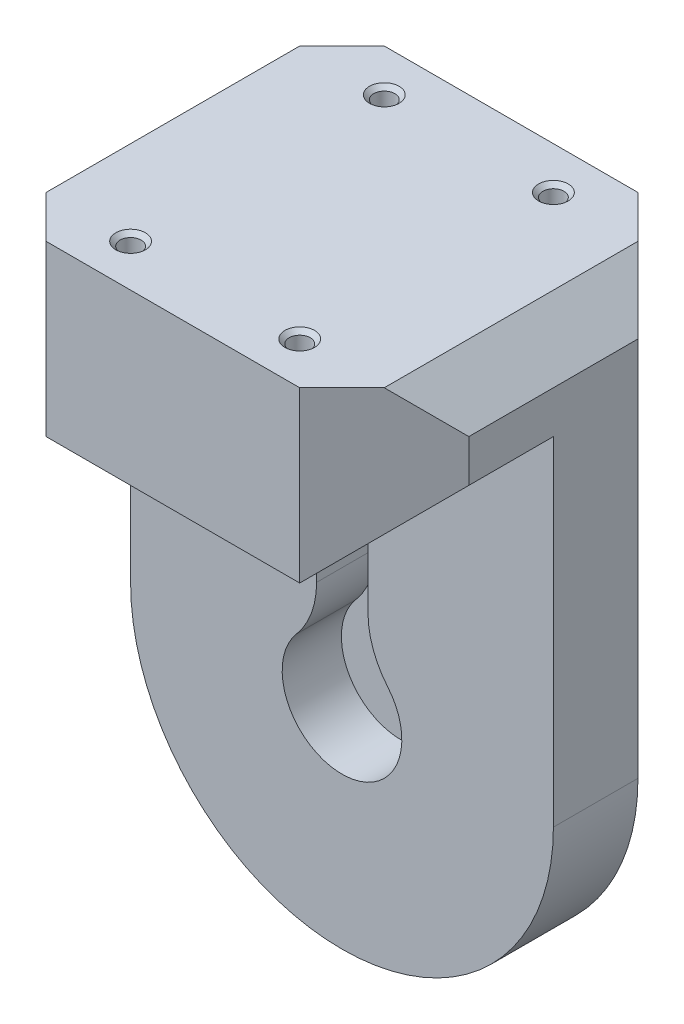
ISO-10303-21;
HEADER;
FILE_DESCRIPTION(('STEP AP214'),'2;1');
FILE_NAME('part.step','',(''),(''),'','','');
FILE_SCHEMA(('AUTOMOTIVE_DESIGN { 1 0 10303 214 1 1 1 1 }'));
ENDSEC;
DATA;
#1=APPLICATION_CONTEXT('core data for automotive mechanical design processes');
#2=APPLICATION_PROTOCOL_DEFINITION('international standard','automotive_design',2000,#1);
#3=PRODUCT_CONTEXT('',#1,'mechanical');
#4=PRODUCT('Part','Part','',(#3));
#5=PRODUCT_RELATED_PRODUCT_CATEGORY('part','',(#4));
#6=PRODUCT_DEFINITION_FORMATION('','',#4);
#7=PRODUCT_DEFINITION_CONTEXT('part definition',#1,'design');
#8=PRODUCT_DEFINITION('design','',#6,#7);
#9=PRODUCT_DEFINITION_SHAPE('','',#8);
#10=(LENGTH_UNIT() NAMED_UNIT(*) SI_UNIT(.MILLI.,.METRE.));
#11=(NAMED_UNIT(*) PLANE_ANGLE_UNIT() SI_UNIT($,.RADIAN.));
#12=(NAMED_UNIT(*) SI_UNIT($,.STERADIAN.) SOLID_ANGLE_UNIT());
#13=UNCERTAINTY_MEASURE_WITH_UNIT(LENGTH_MEASURE(1.E-05),#10,'distance_accuracy_value','');
#14=(GEOMETRIC_REPRESENTATION_CONTEXT(3) GLOBAL_UNCERTAINTY_ASSIGNED_CONTEXT((#13)) GLOBAL_UNIT_ASSIGNED_CONTEXT((#10,
#11,#12)) REPRESENTATION_CONTEXT('',''));
#15=CARTESIAN_POINT('',(0.,0.,0.));
#16=DIRECTION('',(0.,0.,1.));
#17=DIRECTION('',(1.,0.,0.));
#18=AXIS2_PLACEMENT_3D('',#15,#16,#17);
#19=CARTESIAN_POINT('',(-25.,50.,10.));
#20=DIRECTION('',(0.,-1.,0.));
#21=DIRECTION('',(0.,0.,-1.));
#22=AXIS2_PLACEMENT_3D('',#19,#20,#21);
#23=PLANE('',#22);
#24=CARTESIAN_POINT('',(-10.0000000000001,50.,25.));
#25=DIRECTION('',(0.,-1.,0.));
#26=DIRECTION('',(0.,0.,-1.));
#27=AXIS2_PLACEMENT_3D('',#24,#25,#26);
#28=CIRCLE('',#27,1.75);
#29=CARTESIAN_POINT('',(-10.0000000000001,50.,23.25));
#30=VERTEX_POINT('',#29);
#31=EDGE_CURVE('E346',#30,#30,#28,.T.);
#32=ORIENTED_EDGE('',*,*,#31,.T.);
#33=EDGE_LOOP('',(#32));
#34=FACE_BOUND('',#33,.T.);
#35=CARTESIAN_POINT('',(-10.,50.,-5.00000000000002));
#36=DIRECTION('',(0.,-1.,0.));
#37=DIRECTION('',(0.,0.,-1.));
#38=AXIS2_PLACEMENT_3D('',#35,#36,#37);
#39=CIRCLE('',#38,1.75);
#40=CARTESIAN_POINT('',(-10.,50.,-6.75000000000002));
#41=VERTEX_POINT('',#40);
#42=EDGE_CURVE('E343',#41,#41,#39,.T.);
#43=ORIENTED_EDGE('',*,*,#42,.T.);
#44=EDGE_LOOP('',(#43));
#45=FACE_BOUND('',#44,.T.);
#46=CARTESIAN_POINT('',(10.,50.,25.));
#47=DIRECTION('',(0.,-1.,0.));
#48=DIRECTION('',(0.,0.,-1.));
#49=AXIS2_PLACEMENT_3D('',#46,#47,#48);
#50=CIRCLE('',#49,1.75);
#51=CARTESIAN_POINT('',(10.,50.,23.25));
#52=VERTEX_POINT('',#51);
#53=EDGE_CURVE('E340',#52,#52,#50,.T.);
#54=ORIENTED_EDGE('',*,*,#53,.T.);
#55=EDGE_LOOP('',(#54));
#56=FACE_BOUND('',#55,.T.);
#57=CARTESIAN_POINT('',(10.,50.,-5.00000000000002));
#58=DIRECTION('',(0.,-1.,0.));
#59=DIRECTION('',(0.,0.,-1.));
#60=AXIS2_PLACEMENT_3D('',#57,#58,#59);
#61=CIRCLE('',#60,1.75);
#62=CARTESIAN_POINT('',(10.,50.,-6.75000000000002));
#63=VERTEX_POINT('',#62);
#64=EDGE_CURVE('E337',#63,#63,#61,.T.);
#65=ORIENTED_EDGE('',*,*,#64,.T.);
#66=EDGE_LOOP('',(#65));
#67=FACE_BOUND('',#66,.T.);
#68=DIRECTION('',(0.707106781186549,0.,-0.707106781186546));
#69=VECTOR('',#68,1.);
#70=CARTESIAN_POINT('',(-25.,50.,0.));
#71=LINE('',#70,#69);
#72=CARTESIAN_POINT('',(-15.,50.,-10.));
#73=VERTEX_POINT('',#72);
#74=CARTESIAN_POINT('',(-20.,50.,-5.));
#75=VERTEX_POINT('',#74);
#76=EDGE_CURVE('E263',#73,#75,#71,.F.);
#77=ORIENTED_EDGE('',*,*,#76,.T.);
#78=DIRECTION('',(0.,0.,1.));
#79=VECTOR('',#78,1.);
#80=CARTESIAN_POINT('',(-20.,50.,10.));
#81=LINE('',#80,#79);
#82=CARTESIAN_POINT('',(-20.,50.,25.));
#83=VERTEX_POINT('',#82);
#84=EDGE_CURVE('E326',#75,#83,#81,.T.);
#85=ORIENTED_EDGE('',*,*,#84,.T.);
#86=DIRECTION('',(-0.707106781186547,0.,-0.707106781186549));
#87=VECTOR('',#86,1.);
#88=CARTESIAN_POINT('',(-15.,50.,30.));
#89=LINE('',#88,#87);
#90=CARTESIAN_POINT('',(-15.,50.,30.));
#91=VERTEX_POINT('',#90);
#92=EDGE_CURVE('E298',#83,#91,#89,.F.);
#93=ORIENTED_EDGE('',*,*,#92,.T.);
#94=DIRECTION('',(-1.,0.,0.));
#95=VECTOR('',#94,1.);
#96=CARTESIAN_POINT('',(25.,50.,30.));
#97=LINE('',#96,#95);
#98=CARTESIAN_POINT('',(15.,50.,30.));
#99=VERTEX_POINT('',#98);
#100=EDGE_CURVE('E494',#99,#91,#97,.T.);
#101=ORIENTED_EDGE('',*,*,#100,.F.);
#102=DIRECTION('',(-0.707106781186547,0.,0.707106781186549));
#103=VECTOR('',#102,1.);
#104=CARTESIAN_POINT('',(15.,50.,30.));
#105=LINE('',#104,#103);
#106=CARTESIAN_POINT('',(20.,50.,25.));
#107=VERTEX_POINT('',#106);
#108=EDGE_CURVE('E295',#99,#107,#105,.F.);
#109=ORIENTED_EDGE('',*,*,#108,.T.);
#110=DIRECTION('',(0.,0.,-1.));
#111=VECTOR('',#110,1.);
#112=CARTESIAN_POINT('',(20.,50.,10.));
#113=LINE('',#112,#111);
#114=CARTESIAN_POINT('',(20.,50.,-5.));
#115=VERTEX_POINT('',#114);
#116=EDGE_CURVE('E323',#107,#115,#113,.T.);
#117=ORIENTED_EDGE('',*,*,#116,.T.);
#118=DIRECTION('',(0.707106781186549,0.,0.707106781186546));
#119=VECTOR('',#118,1.);
#120=CARTESIAN_POINT('',(25.,50.,0.));
#121=LINE('',#120,#119);
#122=CARTESIAN_POINT('',(15.,50.,-10.));
#123=VERTEX_POINT('',#122);
#124=EDGE_CURVE('E261',#115,#123,#121,.F.);
#125=ORIENTED_EDGE('',*,*,#124,.T.);
#126=DIRECTION('',(-1.,0.,0.));
#127=VECTOR('',#126,1.);
#128=CARTESIAN_POINT('',(-25.,50.,-10.));
#129=LINE('',#128,#127);
#130=EDGE_CURVE('E240',#123,#73,#129,.T.);
#131=ORIENTED_EDGE('',*,*,#130,.T.);
#132=EDGE_LOOP('',(#77,#85,#93,#101,#109,#117,#125,#131));
#133=FACE_BOUND('',#132,.T.);
#134=ADVANCED_FACE('F42',(#34,#45,#56,#67,#133),#23,.F.);
#135=CARTESIAN_POINT('',(-25.,50.,10.));
#136=DIRECTION('',(1.,0.,0.));
#137=DIRECTION('',(0.,1.,0.));
#138=AXIS2_PLACEMENT_3D('',#135,#136,#137);
#139=PLANE('',#138);
#140=DIRECTION('',(0.,1.,0.));
#141=VECTOR('',#140,1.);
#142=CARTESIAN_POINT('',(-25.,50.,20.));
#143=LINE('',#142,#141);
#144=CARTESIAN_POINT('',(-25.,40.,20.));
#145=VERTEX_POINT('',#144);
#146=CARTESIAN_POINT('',(-25.,45.,20.));
#147=VERTEX_POINT('',#146);
#148=EDGE_CURVE('E286',#145,#147,#143,.T.);
#149=ORIENTED_EDGE('',*,*,#148,.T.);
#150=DIRECTION('',(0.,0.,-1.));
#151=VECTOR('',#150,1.);
#152=CARTESIAN_POINT('',(-25.,45.,10.));
#153=LINE('',#152,#151);
#154=CARTESIAN_POINT('',(-25.,45.,0.));
#155=VERTEX_POINT('',#154);
#156=EDGE_CURVE('E310',#147,#155,#153,.T.);
#157=ORIENTED_EDGE('',*,*,#156,.T.);
#158=DIRECTION('',(0.,-1.,0.));
#159=VECTOR('',#158,1.);
#160=CARTESIAN_POINT('',(-25.,50.,0.));
#161=LINE('',#160,#159);
#162=CARTESIAN_POINT('',(-25.,0.,0.));
#163=VERTEX_POINT('',#162);
#164=EDGE_CURVE('E253',#155,#163,#161,.T.);
#165=ORIENTED_EDGE('',*,*,#164,.T.);
#166=DIRECTION('',(0.,0.,-1.));
#167=VECTOR('',#166,1.);
#168=CARTESIAN_POINT('',(-25.,0.,10.));
#169=LINE('',#168,#167);
#170=CARTESIAN_POINT('',(-25.,0.,10.));
#171=VERTEX_POINT('',#170);
#172=EDGE_CURVE('E250',#171,#163,#169,.T.);
#173=ORIENTED_EDGE('',*,*,#172,.F.);
#174=DIRECTION('',(0.,-1.,0.));
#175=VECTOR('',#174,1.);
#176=CARTESIAN_POINT('',(-25.,50.,10.));
#177=LINE('',#176,#175);
#178=CARTESIAN_POINT('',(-25.,40.,10.));
#179=VERTEX_POINT('',#178);
#180=EDGE_CURVE('E237',#179,#171,#177,.T.);
#181=ORIENTED_EDGE('',*,*,#180,.F.);
#182=DIRECTION('',(0.,0.,1.));
#183=VECTOR('',#182,1.);
#184=CARTESIAN_POINT('',(-25.,40.,10.));
#185=LINE('',#184,#183);
#186=EDGE_CURVE('E289',#179,#145,#185,.T.);
#187=ORIENTED_EDGE('',*,*,#186,.T.);
#188=EDGE_LOOP('',(#149,#157,#165,#173,#181,#187));
#189=FACE_BOUND('',#188,.T.);
#190=ADVANCED_FACE('F372',(#189),#139,.F.);
#191=CARTESIAN_POINT('',(0.,0.,10.));
#192=DIRECTION('',(0.,0.,-1.));
#193=DIRECTION('',(-1.,0.,0.));
#194=AXIS2_PLACEMENT_3D('',#191,#192,#193);
#195=CYLINDRICAL_SURFACE('',#194,25.);
#196=ORIENTED_EDGE('',*,*,#172,.T.);
#197=CARTESIAN_POINT('',(0.,0.,0.));
#198=DIRECTION('',(0.,0.,1.));
#199=DIRECTION('',(1.,0.,0.));
#200=AXIS2_PLACEMENT_3D('',#197,#198,#199);
#201=CIRCLE('',#200,25.);
#202=CARTESIAN_POINT('',(25.,0.,0.));
#203=VERTEX_POINT('',#202);
#204=EDGE_CURVE('E268',#163,#203,#201,.T.);
#205=ORIENTED_EDGE('',*,*,#204,.T.);
#206=DIRECTION('',(0.,0.,-1.));
#207=VECTOR('',#206,1.);
#208=CARTESIAN_POINT('',(25.,0.,10.));
#209=LINE('',#208,#207);
#210=CARTESIAN_POINT('',(25.,0.,10.));
#211=VERTEX_POINT('',#210);
#212=EDGE_CURVE('E244',#211,#203,#209,.T.);
#213=ORIENTED_EDGE('',*,*,#212,.F.);
#214=CARTESIAN_POINT('',(0.,0.,10.));
#215=DIRECTION('',(0.,0.,1.));
#216=DIRECTION('',(1.,0.,0.));
#217=AXIS2_PLACEMENT_3D('',#214,#215,#216);
#218=CIRCLE('',#217,25.);
#219=EDGE_CURVE('E239',#171,#211,#218,.T.);
#220=ORIENTED_EDGE('',*,*,#219,.F.);
#221=EDGE_LOOP('',(#196,#205,#213,#220));
#222=FACE_BOUND('',#221,.T.);
#223=ADVANCED_FACE('F380',(#222),#195,.T.);
#224=CARTESIAN_POINT('',(25.,50.,10.));
#225=DIRECTION('',(-1.,0.,0.));
#226=DIRECTION('',(0.,-1.,0.));
#227=AXIS2_PLACEMENT_3D('',#224,#225,#226);
#228=PLANE('',#227);
#229=DIRECTION('',(0.,1.,0.));
#230=VECTOR('',#229,1.);
#231=CARTESIAN_POINT('',(25.,50.,0.));
#232=LINE('',#231,#230);
#233=CARTESIAN_POINT('',(25.,45.,0.));
#234=VERTEX_POINT('',#233);
#235=EDGE_CURVE('E266',#203,#234,#232,.T.);
#236=ORIENTED_EDGE('',*,*,#235,.T.);
#237=DIRECTION('',(0.,0.,1.));
#238=VECTOR('',#237,1.);
#239=CARTESIAN_POINT('',(25.,45.,10.));
#240=LINE('',#239,#238);
#241=CARTESIAN_POINT('',(25.,45.,20.));
#242=VERTEX_POINT('',#241);
#243=EDGE_CURVE('E58',#234,#242,#240,.T.);
#244=ORIENTED_EDGE('',*,*,#243,.T.);
#245=DIRECTION('',(0.,-1.,0.));
#246=VECTOR('',#245,1.);
#247=CARTESIAN_POINT('',(25.,50.,20.));
#248=LINE('',#247,#246);
#249=CARTESIAN_POINT('',(25.,40.,20.));
#250=VERTEX_POINT('',#249);
#251=EDGE_CURVE('E300',#242,#250,#248,.T.);
#252=ORIENTED_EDGE('',*,*,#251,.T.);
#253=DIRECTION('',(0.,0.,-1.));
#254=VECTOR('',#253,1.);
#255=CARTESIAN_POINT('',(25.,40.,10.));
#256=LINE('',#255,#254);
#257=CARTESIAN_POINT('',(25.,40.,10.));
#258=VERTEX_POINT('',#257);
#259=EDGE_CURVE('E302',#250,#258,#256,.T.);
#260=ORIENTED_EDGE('',*,*,#259,.T.);
#261=DIRECTION('',(0.,1.,0.));
#262=VECTOR('',#261,1.);
#263=CARTESIAN_POINT('',(25.,50.,10.));
#264=LINE('',#263,#262);
#265=EDGE_CURVE('E242',#211,#258,#264,.T.);
#266=ORIENTED_EDGE('',*,*,#265,.F.);
#267=ORIENTED_EDGE('',*,*,#212,.T.);
#268=EDGE_LOOP('',(#236,#244,#252,#260,#266,#267));
#269=FACE_BOUND('',#268,.T.);
#270=ADVANCED_FACE('F560',(#269),#228,.F.);
#271=CARTESIAN_POINT('',(0.,0.,10.));
#272=DIRECTION('',(0.,0.,1.));
#273=DIRECTION('',(1.,0.,0.));
#274=AXIS2_PLACEMENT_3D('',#271,#272,#273);
#275=PLANE('',#274);
#276=DIRECTION('',(1.,0.,0.));
#277=VECTOR('',#276,1.);
#278=CARTESIAN_POINT('',(25.,30.,10.));
#279=LINE('',#278,#277);
#280=CARTESIAN_POINT('',(-15.,30.,10.));
#281=VERTEX_POINT('',#280);
#282=CARTESIAN_POINT('',(15.,30.,10.));
#283=VERTEX_POINT('',#282);
#284=EDGE_CURVE('E314',#281,#283,#279,.T.);
#285=ORIENTED_EDGE('',*,*,#284,.F.);
#286=DIRECTION('',(0.707106781186547,-0.707106781186548,0.));
#287=VECTOR('',#286,1.);
#288=CARTESIAN_POINT('',(-15.,30.,10.));
#289=LINE('',#288,#287);
#290=EDGE_CURVE('E305',#281,#179,#289,.F.);
#291=ORIENTED_EDGE('',*,*,#290,.T.);
#292=ORIENTED_EDGE('',*,*,#180,.T.);
#293=ORIENTED_EDGE('',*,*,#219,.T.);
#294=ORIENTED_EDGE('',*,*,#265,.T.);
#295=DIRECTION('',(0.707106781186546,0.707106781186549,0.));
#296=VECTOR('',#295,1.);
#297=CARTESIAN_POINT('',(25.,40.,10.));
#298=LINE('',#297,#296);
#299=EDGE_CURVE('E308',#258,#283,#298,.F.);
#300=ORIENTED_EDGE('',*,*,#299,.T.);
#301=EDGE_LOOP('',(#285,#291,#292,#293,#294,#300));
#302=FACE_BOUND('',#301,.T.);
#303=CARTESIAN_POINT('',(0.,24.5,10.));
#304=DIRECTION('',(0.,0.,1.));
#305=DIRECTION('',(1.,0.,0.));
#306=AXIS2_PLACEMENT_3D('',#303,#304,#305);
#307=CIRCLE('',#306,3.075);
#308=CARTESIAN_POINT('',(3.075,24.5,10.));
#309=VERTEX_POINT('',#308);
#310=CARTESIAN_POINT('',(-2.99999999999996,23.8249999999998,10.));
#311=VERTEX_POINT('',#310);
#312=EDGE_CURVE('E181',#309,#311,#307,.T.);
#313=ORIENTED_EDGE('',*,*,#312,.F.);
#314=DIRECTION('',(0.,-1.,0.));
#315=VECTOR('',#314,1.);
#316=CARTESIAN_POINT('',(3.075,0.,10.));
#317=LINE('',#316,#315);
#318=CARTESIAN_POINT('',(3.075,10.9818031306339,10.));
#319=VERTEX_POINT('',#318);
#320=EDGE_CURVE('E199',#309,#319,#317,.T.);
#321=ORIENTED_EDGE('',*,*,#320,.T.);
#322=CARTESIAN_POINT('',(13.075,10.9818031306339,10.));
#323=DIRECTION('',(0.,0.,1.));
#324=DIRECTION('',(1.,0.,0.));
#325=AXIS2_PLACEMENT_3D('',#322,#323,#324);
#326=CIRCLE('',#325,10.);
#327=CARTESIAN_POINT('',(5.41760614934114,4.5502932444647,10.));
#328=VERTEX_POINT('',#327);
#329=EDGE_CURVE('E202',#319,#328,#326,.T.);
#330=ORIENTED_EDGE('',*,*,#329,.T.);
#331=CARTESIAN_POINT('',(0.,0.,10.));
#332=DIRECTION('',(0.,0.,1.));
#333=DIRECTION('',(1.,0.,0.));
#334=AXIS2_PLACEMENT_3D('',#331,#332,#333);
#335=CIRCLE('',#334,7.075);
#336=CARTESIAN_POINT('',(-5.38653001464128,4.5870381948888,10.));
#337=VERTEX_POINT('',#336);
#338=EDGE_CURVE('E222',#337,#328,#335,.T.);
#339=ORIENTED_EDGE('',*,*,#338,.F.);
#340=CARTESIAN_POINT('',(-13.,11.0704844067458,10.));
#341=DIRECTION('',(0.,0.,1.));
#342=DIRECTION('',(1.,0.,0.));
#343=AXIS2_PLACEMENT_3D('',#340,#341,#342);
#344=CIRCLE('',#343,10.);
#345=CARTESIAN_POINT('',(-2.99999999999996,11.0704844067458,10.));
#346=VERTEX_POINT('',#345);
#347=EDGE_CURVE('E219',#346,#337,#344,.F.);
#348=ORIENTED_EDGE('',*,*,#347,.F.);
#349=DIRECTION('',(0.,-1.,0.));
#350=VECTOR('',#349,1.);
#351=CARTESIAN_POINT('',(-2.99999999999996,0.,10.));
#352=LINE('',#351,#350);
#353=EDGE_CURVE('E216',#311,#346,#352,.T.);
#354=ORIENTED_EDGE('',*,*,#353,.F.);
#355=EDGE_LOOP('',(#313,#321,#330,#339,#348,#354));
#356=FACE_BOUND('',#355,.T.);
#357=ADVANCED_FACE('F557',(#302,#356),#275,.T.);
#358=CARTESIAN_POINT('',(0.,0.,-10.));
#359=DIRECTION('',(0.,0.,1.));
#360=DIRECTION('',(1.,0.,0.));
#361=AXIS2_PLACEMENT_3D('',#358,#359,#360);
#362=PLANE('',#361);
#363=CARTESIAN_POINT('',(0.,0.,-10.));
#364=DIRECTION('',(0.,0.,-1.));
#365=DIRECTION('',(-1.,0.,0.));
#366=AXIS2_PLACEMENT_3D('',#363,#364,#365);
#367=CIRCLE('',#366,4.);
#368=CARTESIAN_POINT('',(-3.99999999999999,0.,-10.));
#369=VERTEX_POINT('',#368);
#370=EDGE_CURVE('E509',#369,#369,#367,.T.);
#371=ORIENTED_EDGE('',*,*,#370,.F.);
#372=EDGE_LOOP('',(#371));
#373=FACE_BOUND('',#372,.T.);
#374=CARTESIAN_POINT('',(0.,24.5,-10.));
#375=DIRECTION('',(0.,0.,-1.));
#376=DIRECTION('',(-1.,0.,0.));
#377=AXIS2_PLACEMENT_3D('',#374,#375,#376);
#378=CIRCLE('',#377,4.);
#379=CARTESIAN_POINT('',(-4.,24.5,-10.));
#380=VERTEX_POINT('',#379);
#381=EDGE_CURVE('E511',#380,#380,#378,.T.);
#382=ORIENTED_EDGE('',*,*,#381,.F.);
#383=EDGE_LOOP('',(#382));
#384=FACE_BOUND('',#383,.T.);
#385=CARTESIAN_POINT('',(0.,0.,-10.));
#386=DIRECTION('',(0.,0.,1.));
#387=DIRECTION('',(1.,0.,0.));
#388=AXIS2_PLACEMENT_3D('',#385,#386,#387);
#389=CIRCLE('',#388,15.);
#390=CARTESIAN_POINT('',(15.,0.,-10.));
#391=VERTEX_POINT('',#390);
#392=CARTESIAN_POINT('',(-15.,0.,-10.));
#393=VERTEX_POINT('',#392);
#394=EDGE_CURVE('E255',#391,#393,#389,.F.);
#395=ORIENTED_EDGE('',*,*,#394,.T.);
#396=DIRECTION('',(0.,1.,0.));
#397=VECTOR('',#396,1.);
#398=CARTESIAN_POINT('',(-15.,0.,-10.));
#399=LINE('',#398,#397);
#400=EDGE_CURVE('E259',#393,#73,#399,.T.);
#401=ORIENTED_EDGE('',*,*,#400,.T.);
#402=ORIENTED_EDGE('',*,*,#130,.F.);
#403=DIRECTION('',(0.,-1.,0.));
#404=VECTOR('',#403,1.);
#405=CARTESIAN_POINT('',(15.,0.,-10.));
#406=LINE('',#405,#404);
#407=EDGE_CURVE('E257',#123,#391,#406,.T.);
#408=ORIENTED_EDGE('',*,*,#407,.T.);
#409=EDGE_LOOP('',(#395,#401,#402,#408));
#410=FACE_BOUND('',#409,.T.);
#411=ADVANCED_FACE('F407',(#373,#384,#410),#362,.F.);
#412=CARTESIAN_POINT('',(25.,50.,0.));
#413=DIRECTION('',(-0.707106781186546,0.,0.707106781186549));
#414=DIRECTION('',(0.,1.,0.));
#415=AXIS2_PLACEMENT_3D('',#412,#413,#414);
#416=PLANE('',#415);
#417=ORIENTED_EDGE('',*,*,#124,.F.);
#418=DIRECTION('',(0.577350269189626,-0.577350269189628,0.577350269189624));
#419=VECTOR('',#418,1.);
#420=CARTESIAN_POINT('',(23.3333333333333,46.6666666666667,-1.66666666666669));
#421=LINE('',#420,#419);
#422=EDGE_CURVE('E66',#115,#234,#421,.T.);
#423=ORIENTED_EDGE('',*,*,#422,.T.);
#424=ORIENTED_EDGE('',*,*,#235,.F.);
#425=DIRECTION('',(0.707106781186549,0.,0.707106781186546));
#426=VECTOR('',#425,1.);
#427=CARTESIAN_POINT('',(15.,0.,-10.));
#428=LINE('',#427,#426);
#429=EDGE_CURVE('E247',#391,#203,#428,.T.);
#430=ORIENTED_EDGE('',*,*,#429,.F.);
#431=ORIENTED_EDGE('',*,*,#407,.F.);
#432=EDGE_LOOP('',(#417,#423,#424,#430,#431));
#433=FACE_BOUND('',#432,.T.);
#434=ADVANCED_FACE('F401',(#433),#416,.F.);
#435=CARTESIAN_POINT('',(0.,0.,0.));
#436=DIRECTION('',(0.,0.,1.));
#437=DIRECTION('',(1.,0.,0.));
#438=AXIS2_PLACEMENT_3D('',#435,#436,#437);
#439=CONICAL_SURFACE('',#438,25.,0.78539816339745);
#440=ORIENTED_EDGE('',*,*,#429,.T.);
#441=ORIENTED_EDGE('',*,*,#204,.F.);
#442=DIRECTION('',(-0.707106781186549,0.,0.707106781186546));
#443=VECTOR('',#442,1.);
#444=CARTESIAN_POINT('',(-15.,0.,-10.));
#445=LINE('',#444,#443);
#446=EDGE_CURVE('E229',#393,#163,#445,.T.);
#447=ORIENTED_EDGE('',*,*,#446,.F.);
#448=ORIENTED_EDGE('',*,*,#394,.F.);
#449=EDGE_LOOP('',(#440,#441,#447,#448));
#450=FACE_BOUND('',#449,.T.);
#451=ADVANCED_FACE('F394',(#450),#439,.T.);
#452=CARTESIAN_POINT('',(-25.,50.,0.));
#453=DIRECTION('',(0.707106781186546,0.,0.707106781186549));
#454=DIRECTION('',(0.,-1.,0.));
#455=AXIS2_PLACEMENT_3D('',#452,#453,#454);
#456=PLANE('',#455);
#457=ORIENTED_EDGE('',*,*,#164,.F.);
#458=DIRECTION('',(0.577350269189627,0.577350269189626,-0.577350269189625));
#459=VECTOR('',#458,1.);
#460=CARTESIAN_POINT('',(-23.3333333333333,46.6666666666667,-1.66666666666668));
#461=LINE('',#460,#459);
#462=EDGE_CURVE('E321',#155,#75,#461,.T.);
#463=ORIENTED_EDGE('',*,*,#462,.T.);
#464=ORIENTED_EDGE('',*,*,#76,.F.);
#465=ORIENTED_EDGE('',*,*,#400,.F.);
#466=ORIENTED_EDGE('',*,*,#446,.T.);
#467=EDGE_LOOP('',(#457,#463,#464,#465,#466));
#468=FACE_BOUND('',#467,.T.);
#469=ADVANCED_FACE('F387',(#468),#456,.F.);
#470=CARTESIAN_POINT('',(0.,24.5,3.00000000000001));
#471=DIRECTION('',(0.,0.,1.));
#472=DIRECTION('',(1.,0.,0.));
#473=AXIS2_PLACEMENT_3D('',#470,#471,#472);
#474=CYLINDRICAL_SURFACE('',#473,3.075);
#475=ORIENTED_EDGE('',*,*,#312,.T.);
#476=DIRECTION('',(0.,0.,1.));
#477=VECTOR('',#476,1.);
#478=CARTESIAN_POINT('',(-2.99999999999996,23.8249999999998,3.00000000000001));
#479=LINE('',#478,#477);
#480=CARTESIAN_POINT('',(-2.99999999999996,23.8249999999998,3.00000000000001));
#481=VERTEX_POINT('',#480);
#482=EDGE_CURVE('E175',#481,#311,#479,.T.);
#483=ORIENTED_EDGE('',*,*,#482,.F.);
#484=CARTESIAN_POINT('',(0.,24.5,3.00000000000001));
#485=DIRECTION('',(0.,0.,1.));
#486=DIRECTION('',(1.,0.,0.));
#487=AXIS2_PLACEMENT_3D('',#484,#485,#486);
#488=CIRCLE('',#487,3.075);
#489=CARTESIAN_POINT('',(3.075,24.5,3.00000000000001));
#490=VERTEX_POINT('',#489);
#491=EDGE_CURVE('E179',#490,#481,#488,.T.);
#492=ORIENTED_EDGE('',*,*,#491,.F.);
#493=DIRECTION('',(0.,0.,1.));
#494=VECTOR('',#493,1.);
#495=CARTESIAN_POINT('',(3.075,24.5,3.00000000000001));
#496=LINE('',#495,#494);
#497=EDGE_CURVE('E227',#490,#309,#496,.T.);
#498=ORIENTED_EDGE('',*,*,#497,.T.);
#499=EDGE_LOOP('',(#475,#483,#492,#498));
#500=FACE_BOUND('',#499,.T.);
#501=ADVANCED_FACE('F177',(#500),#474,.F.);
#502=CARTESIAN_POINT('',(3.075,0.,3.00000000000001));
#503=DIRECTION('',(-1.,0.,0.));
#504=DIRECTION('',(0.,0.,1.));
#505=AXIS2_PLACEMENT_3D('',#502,#503,#504);
#506=PLANE('',#505);
#507=ORIENTED_EDGE('',*,*,#320,.F.);
#508=ORIENTED_EDGE('',*,*,#497,.F.);
#509=DIRECTION('',(0.,-1.,0.));
#510=VECTOR('',#509,1.);
#511=CARTESIAN_POINT('',(3.075,0.,3.00000000000001));
#512=LINE('',#511,#510);
#513=CARTESIAN_POINT('',(3.075,10.9818031306339,3.00000000000001));
#514=VERTEX_POINT('',#513);
#515=EDGE_CURVE('E186',#490,#514,#512,.T.);
#516=ORIENTED_EDGE('',*,*,#515,.T.);
#517=DIRECTION('',(0.,0.,1.));
#518=VECTOR('',#517,1.);
#519=CARTESIAN_POINT('',(3.075,10.9818031306339,3.00000000000001));
#520=LINE('',#519,#518);
#521=EDGE_CURVE('E230',#514,#319,#520,.T.);
#522=ORIENTED_EDGE('',*,*,#521,.T.);
#523=EDGE_LOOP('',(#507,#508,#516,#522));
#524=FACE_BOUND('',#523,.T.);
#525=ADVANCED_FACE('F537',(#524),#506,.T.);
#526=CARTESIAN_POINT('',(13.075,10.9818031306339,3.00000000000001));
#527=DIRECTION('',(0.,0.,1.));
#528=DIRECTION('',(1.,0.,0.));
#529=AXIS2_PLACEMENT_3D('',#526,#527,#528);
#530=CYLINDRICAL_SURFACE('',#529,10.);
#531=ORIENTED_EDGE('',*,*,#329,.F.);
#532=ORIENTED_EDGE('',*,*,#521,.F.);
#533=CARTESIAN_POINT('',(13.075,10.9818031306339,3.00000000000001));
#534=DIRECTION('',(0.,0.,1.));
#535=DIRECTION('',(1.,0.,0.));
#536=AXIS2_PLACEMENT_3D('',#533,#534,#535);
#537=CIRCLE('',#536,10.);
#538=CARTESIAN_POINT('',(5.41760614934114,4.5502932444647,3.00000000000001));
#539=VERTEX_POINT('',#538);
#540=EDGE_CURVE('E212',#514,#539,#537,.T.);
#541=ORIENTED_EDGE('',*,*,#540,.T.);
#542=DIRECTION('',(0.,0.,1.));
#543=VECTOR('',#542,1.);
#544=CARTESIAN_POINT('',(5.41760614934114,4.5502932444647,3.00000000000001));
#545=LINE('',#544,#543);
#546=EDGE_CURVE('E232',#539,#328,#545,.T.);
#547=ORIENTED_EDGE('',*,*,#546,.T.);
#548=EDGE_LOOP('',(#531,#532,#541,#547));
#549=FACE_BOUND('',#548,.T.);
#550=ADVANCED_FACE('F540',(#549),#530,.T.);
#551=CARTESIAN_POINT('',(0.,0.,3.00000000000001));
#552=DIRECTION('',(0.,0.,1.));
#553=DIRECTION('',(1.,0.,0.));
#554=AXIS2_PLACEMENT_3D('',#551,#552,#553);
#555=CYLINDRICAL_SURFACE('',#554,7.075);
#556=ORIENTED_EDGE('',*,*,#338,.T.);
#557=ORIENTED_EDGE('',*,*,#546,.F.);
#558=CARTESIAN_POINT('',(0.,0.,3.00000000000001));
#559=DIRECTION('',(0.,0.,1.));
#560=DIRECTION('',(1.,0.,0.));
#561=AXIS2_PLACEMENT_3D('',#558,#559,#560);
#562=CIRCLE('',#561,7.075);
#563=CARTESIAN_POINT('',(-5.38653001464128,4.5870381948888,3.00000000000001));
#564=VERTEX_POINT('',#563);
#565=EDGE_CURVE('E209',#564,#539,#562,.T.);
#566=ORIENTED_EDGE('',*,*,#565,.F.);
#567=DIRECTION('',(0.,0.,1.));
#568=VECTOR('',#567,1.);
#569=CARTESIAN_POINT('',(-5.38653001464128,4.5870381948888,3.00000000000001));
#570=LINE('',#569,#568);
#571=EDGE_CURVE('E234',#564,#337,#570,.T.);
#572=ORIENTED_EDGE('',*,*,#571,.T.);
#573=EDGE_LOOP('',(#556,#557,#566,#572));
#574=FACE_BOUND('',#573,.T.);
#575=ADVANCED_FACE('F544',(#574),#555,.F.);
#576=CARTESIAN_POINT('',(-13.,11.0704844067458,3.00000000000001));
#577=DIRECTION('',(0.,0.,1.));
#578=DIRECTION('',(1.,0.,0.));
#579=AXIS2_PLACEMENT_3D('',#576,#577,#578);
#580=CYLINDRICAL_SURFACE('',#579,10.);
#581=ORIENTED_EDGE('',*,*,#347,.T.);
#582=ORIENTED_EDGE('',*,*,#571,.F.);
#583=CARTESIAN_POINT('',(-13.,11.0704844067458,3.00000000000001));
#584=DIRECTION('',(0.,0.,1.));
#585=DIRECTION('',(1.,0.,0.));
#586=AXIS2_PLACEMENT_3D('',#583,#584,#585);
#587=CIRCLE('',#586,10.);
#588=CARTESIAN_POINT('',(-2.99999999999996,11.0704844067458,3.00000000000001));
#589=VERTEX_POINT('',#588);
#590=EDGE_CURVE('E194',#589,#564,#587,.F.);
#591=ORIENTED_EDGE('',*,*,#590,.F.);
#592=DIRECTION('',(0.,0.,1.));
#593=VECTOR('',#592,1.);
#594=CARTESIAN_POINT('',(-2.99999999999996,11.0704844067458,3.00000000000001));
#595=LINE('',#594,#593);
#596=EDGE_CURVE('E185',#589,#346,#595,.T.);
#597=ORIENTED_EDGE('',*,*,#596,.T.);
#598=EDGE_LOOP('',(#581,#582,#591,#597));
#599=FACE_BOUND('',#598,.T.);
#600=ADVANCED_FACE('F548',(#599),#580,.T.);
#601=CARTESIAN_POINT('',(-2.99999999999996,0.,3.00000000000001));
#602=DIRECTION('',(-1.,0.,0.));
#603=DIRECTION('',(0.,0.,1.));
#604=AXIS2_PLACEMENT_3D('',#601,#602,#603);
#605=PLANE('',#604);
#606=ORIENTED_EDGE('',*,*,#353,.T.);
#607=ORIENTED_EDGE('',*,*,#596,.F.);
#608=DIRECTION('',(0.,-1.,0.));
#609=VECTOR('',#608,1.);
#610=CARTESIAN_POINT('',(-2.99999999999996,0.,3.00000000000001));
#611=LINE('',#610,#609);
#612=EDGE_CURVE('E189',#481,#589,#611,.T.);
#613=ORIENTED_EDGE('',*,*,#612,.F.);
#614=ORIENTED_EDGE('',*,*,#482,.T.);
#615=EDGE_LOOP('',(#606,#607,#613,#614));
#616=FACE_BOUND('',#615,.T.);
#617=ADVANCED_FACE('F190',(#616),#605,.F.);
#618=CARTESIAN_POINT('',(0.,0.,3.00000000000001));
#619=DIRECTION('',(0.,0.,1.));
#620=DIRECTION('',(1.,0.,0.));
#621=AXIS2_PLACEMENT_3D('',#618,#619,#620);
#622=PLANE('',#621);
#623=CARTESIAN_POINT('',(0.,24.5,3.00000000000001));
#624=DIRECTION('',(0.,0.,1.));
#625=DIRECTION('',(1.,0.,0.));
#626=AXIS2_PLACEMENT_3D('',#623,#624,#625);
#627=CIRCLE('',#626,1.5);
#628=CARTESIAN_POINT('',(1.5,24.5,3.00000000000001));
#629=VERTEX_POINT('',#628);
#630=EDGE_CURVE('E278',#629,#629,#627,.T.);
#631=ORIENTED_EDGE('',*,*,#630,.F.);
#632=EDGE_LOOP('',(#631));
#633=FACE_BOUND('',#632,.T.);
#634=CARTESIAN_POINT('',(0.,0.,3.00000000000001));
#635=DIRECTION('',(0.,0.,1.));
#636=DIRECTION('',(1.,0.,0.));
#637=AXIS2_PLACEMENT_3D('',#634,#635,#636);
#638=CIRCLE('',#637,1.5);
#639=CARTESIAN_POINT('',(1.50000000000001,0.,3.00000000000001));
#640=VERTEX_POINT('',#639);
#641=EDGE_CURVE('E275',#640,#640,#638,.T.);
#642=ORIENTED_EDGE('',*,*,#641,.F.);
#643=EDGE_LOOP('',(#642));
#644=FACE_BOUND('',#643,.T.);
#645=ORIENTED_EDGE('',*,*,#491,.T.);
#646=ORIENTED_EDGE('',*,*,#612,.T.);
#647=ORIENTED_EDGE('',*,*,#590,.T.);
#648=ORIENTED_EDGE('',*,*,#565,.T.);
#649=ORIENTED_EDGE('',*,*,#540,.F.);
#650=ORIENTED_EDGE('',*,*,#515,.F.);
#651=EDGE_LOOP('',(#645,#646,#647,#648,#649,#650));
#652=FACE_BOUND('',#651,.T.);
#653=ADVANCED_FACE('F197',(#633,#644,#652),#622,.T.);
#654=CARTESIAN_POINT('',(0.,24.5,0.999999999999996));
#655=DIRECTION('',(0.,0.,-1.));
#656=DIRECTION('',(-1.,0.,0.));
#657=AXIS2_PLACEMENT_3D('',#654,#655,#656);
#658=CYLINDRICAL_SURFACE('',#657,4.);
#659=CARTESIAN_POINT('',(0.,24.5,0.999999999999996));
#660=DIRECTION('',(0.,0.,-1.));
#661=DIRECTION('',(-1.,0.,0.));
#662=AXIS2_PLACEMENT_3D('',#659,#660,#661);
#663=CIRCLE('',#662,4.);
#664=CARTESIAN_POINT('',(-4.,24.5,0.999999999999996));
#665=VERTEX_POINT('',#664);
#666=EDGE_CURVE('E205',#665,#665,#663,.T.);
#667=ORIENTED_EDGE('',*,*,#666,.F.);
#668=EDGE_LOOP('',(#667));
#669=FACE_BOUND('',#668,.T.);
#670=ORIENTED_EDGE('',*,*,#381,.T.);
#671=EDGE_LOOP('',(#670));
#672=FACE_BOUND('',#671,.T.);
#673=ADVANCED_FACE('F520',(#669,#672),#658,.F.);
#674=CARTESIAN_POINT('',(0.,24.5,0.999999999999996));
#675=DIRECTION('',(0.,0.,-1.));
#676=DIRECTION('',(-1.,0.,0.));
#677=AXIS2_PLACEMENT_3D('',#674,#675,#676);
#678=PLANE('',#677);
#679=CARTESIAN_POINT('',(0.,24.5,0.999999999999996));
#680=DIRECTION('',(0.,0.,-1.));
#681=DIRECTION('',(-1.,0.,0.));
#682=AXIS2_PLACEMENT_3D('',#679,#680,#681);
#683=CIRCLE('',#682,1.5);
#684=CARTESIAN_POINT('',(-1.5,24.5,0.999999999999996));
#685=VERTEX_POINT('',#684);
#686=EDGE_CURVE('E279',#685,#685,#683,.T.);
#687=ORIENTED_EDGE('',*,*,#686,.F.);
#688=EDGE_LOOP('',(#687));
#689=FACE_BOUND('',#688,.T.);
#690=ORIENTED_EDGE('',*,*,#666,.T.);
#691=EDGE_LOOP('',(#690));
#692=FACE_BOUND('',#691,.T.);
#693=ADVANCED_FACE('F518',(#689,#692),#678,.T.);
#694=CARTESIAN_POINT('',(0.,0.,0.999999999999996));
#695=DIRECTION('',(0.,0.,-1.));
#696=DIRECTION('',(-1.,0.,0.));
#697=AXIS2_PLACEMENT_3D('',#694,#695,#696);
#698=CYLINDRICAL_SURFACE('',#697,4.);
#699=CARTESIAN_POINT('',(0.,0.,0.999999999999996));
#700=DIRECTION('',(0.,0.,-1.));
#701=DIRECTION('',(-1.,0.,0.));
#702=AXIS2_PLACEMENT_3D('',#699,#700,#701);
#703=CIRCLE('',#702,4.);
#704=CARTESIAN_POINT('',(-3.99999999999999,0.,0.999999999999996));
#705=VERTEX_POINT('',#704);
#706=EDGE_CURVE('E217',#705,#705,#703,.T.);
#707=ORIENTED_EDGE('',*,*,#706,.F.);
#708=EDGE_LOOP('',(#707));
#709=FACE_BOUND('',#708,.T.);
#710=ORIENTED_EDGE('',*,*,#370,.T.);
#711=EDGE_LOOP('',(#710));
#712=FACE_BOUND('',#711,.T.);
#713=ADVANCED_FACE('F528',(#709,#712),#698,.F.);
#714=CARTESIAN_POINT('',(0.,0.,0.999999999999996));
#715=DIRECTION('',(0.,0.,-1.));
#716=DIRECTION('',(-1.,0.,0.));
#717=AXIS2_PLACEMENT_3D('',#714,#715,#716);
#718=PLANE('',#717);
#719=CARTESIAN_POINT('',(0.,0.,0.999999999999996));
#720=DIRECTION('',(0.,0.,-1.));
#721=DIRECTION('',(-1.,0.,0.));
#722=AXIS2_PLACEMENT_3D('',#719,#720,#721);
#723=CIRCLE('',#722,1.5);
#724=CARTESIAN_POINT('',(-1.49999999999999,0.,0.999999999999996));
#725=VERTEX_POINT('',#724);
#726=EDGE_CURVE('E500',#725,#725,#723,.T.);
#727=ORIENTED_EDGE('',*,*,#726,.F.);
#728=EDGE_LOOP('',(#727));
#729=FACE_BOUND('',#728,.T.);
#730=ORIENTED_EDGE('',*,*,#706,.T.);
#731=EDGE_LOOP('',(#730));
#732=FACE_BOUND('',#731,.T.);
#733=ADVANCED_FACE('F629',(#729,#732),#718,.T.);
#734=CARTESIAN_POINT('',(0.,0.,12.));
#735=DIRECTION('',(0.,0.,-1.));
#736=DIRECTION('',(-1.,0.,0.));
#737=AXIS2_PLACEMENT_3D('',#734,#735,#736);
#738=CYLINDRICAL_SURFACE('',#737,1.5);
#739=ORIENTED_EDGE('',*,*,#641,.T.);
#740=EDGE_LOOP('',(#739));
#741=FACE_BOUND('',#740,.T.);
#742=ORIENTED_EDGE('',*,*,#726,.T.);
#743=EDGE_LOOP('',(#742));
#744=FACE_BOUND('',#743,.T.);
#745=ADVANCED_FACE('F623',(#741,#744),#738,.F.);
#746=CARTESIAN_POINT('',(0.,24.5,12.));
#747=DIRECTION('',(0.,0.,-1.));
#748=DIRECTION('',(-1.,0.,0.));
#749=AXIS2_PLACEMENT_3D('',#746,#747,#748);
#750=CYLINDRICAL_SURFACE('',#749,1.5);
#751=ORIENTED_EDGE('',*,*,#630,.T.);
#752=EDGE_LOOP('',(#751));
#753=FACE_BOUND('',#752,.T.);
#754=ORIENTED_EDGE('',*,*,#686,.T.);
#755=EDGE_LOOP('',(#754));
#756=FACE_BOUND('',#755,.T.);
#757=ADVANCED_FACE('F616',(#753,#756),#750,.F.);
#758=CARTESIAN_POINT('',(25.,30.,30.));
#759=DIRECTION('',(0.,1.,0.));
#760=DIRECTION('',(-1.,0.,0.));
#761=AXIS2_PLACEMENT_3D('',#758,#759,#760);
#762=PLANE('',#761);
#763=DIRECTION('',(1.,0.,0.));
#764=VECTOR('',#763,1.);
#765=CARTESIAN_POINT('',(25.,30.,30.));
#766=LINE('',#765,#764);
#767=CARTESIAN_POINT('',(-15.,30.,30.));
#768=VERTEX_POINT('',#767);
#769=CARTESIAN_POINT('',(15.,30.,30.));
#770=VERTEX_POINT('',#769);
#771=EDGE_CURVE('E497',#768,#770,#766,.T.);
#772=ORIENTED_EDGE('',*,*,#771,.F.);
#773=DIRECTION('',(0.,0.,-1.));
#774=VECTOR('',#773,1.);
#775=CARTESIAN_POINT('',(-15.,30.,30.));
#776=LINE('',#775,#774);
#777=EDGE_CURVE('E283',#768,#281,#776,.T.);
#778=ORIENTED_EDGE('',*,*,#777,.T.);
#779=ORIENTED_EDGE('',*,*,#284,.T.);
#780=DIRECTION('',(0.,0.,1.));
#781=VECTOR('',#780,1.);
#782=CARTESIAN_POINT('',(15.,30.,30.));
#783=LINE('',#782,#781);
#784=EDGE_CURVE('E270',#283,#770,#783,.T.);
#785=ORIENTED_EDGE('',*,*,#784,.T.);
#786=EDGE_LOOP('',(#772,#778,#779,#785));
#787=FACE_BOUND('',#786,.T.);
#788=ADVANCED_FACE('F600',(#787),#762,.F.);
#789=CARTESIAN_POINT('',(0.,0.,30.));
#790=DIRECTION('',(0.,0.,-1.));
#791=DIRECTION('',(-1.,0.,0.));
#792=AXIS2_PLACEMENT_3D('',#789,#790,#791);
#793=PLANE('',#792);
#794=ORIENTED_EDGE('',*,*,#100,.T.);
#795=DIRECTION('',(0.,-1.,0.));
#796=VECTOR('',#795,1.);
#797=CARTESIAN_POINT('',(-15.,0.,30.));
#798=LINE('',#797,#796);
#799=EDGE_CURVE('E293',#91,#768,#798,.T.);
#800=ORIENTED_EDGE('',*,*,#799,.T.);
#801=ORIENTED_EDGE('',*,*,#771,.T.);
#802=DIRECTION('',(0.,1.,0.));
#803=VECTOR('',#802,1.);
#804=CARTESIAN_POINT('',(15.,0.,30.));
#805=LINE('',#804,#803);
#806=EDGE_CURVE('E291',#770,#99,#805,.T.);
#807=ORIENTED_EDGE('',*,*,#806,.T.);
#808=EDGE_LOOP('',(#794,#800,#801,#807));
#809=FACE_BOUND('',#808,.T.);
#810=ADVANCED_FACE('F422',(#809),#793,.F.);
#811=CARTESIAN_POINT('',(-15.,0.,30.));
#812=DIRECTION('',(0.707106781186548,0.,-0.707106781186546));
#813=DIRECTION('',(0.,-1.,0.));
#814=AXIS2_PLACEMENT_3D('',#811,#812,#813);
#815=PLANE('',#814);
#816=ORIENTED_EDGE('',*,*,#92,.F.);
#817=DIRECTION('',(-0.577350269189625,-0.577350269189625,-0.577350269189627));
#818=VECTOR('',#817,1.);
#819=CARTESIAN_POINT('',(-33.3333333333333,36.6666666666667,11.6666666666667));
#820=LINE('',#819,#818);
#821=EDGE_CURVE('E328',#83,#147,#820,.T.);
#822=ORIENTED_EDGE('',*,*,#821,.T.);
#823=ORIENTED_EDGE('',*,*,#148,.F.);
#824=DIRECTION('',(0.577350269189625,-0.577350269189626,0.577350269189626));
#825=VECTOR('',#824,1.);
#826=CARTESIAN_POINT('',(-5.00000000000001,20.,40.));
#827=LINE('',#826,#825);
#828=EDGE_CURVE('E311',#768,#145,#827,.F.);
#829=ORIENTED_EDGE('',*,*,#828,.F.);
#830=ORIENTED_EDGE('',*,*,#799,.F.);
#831=EDGE_LOOP('',(#816,#822,#823,#829,#830));
#832=FACE_BOUND('',#831,.T.);
#833=ADVANCED_FACE('F416',(#832),#815,.F.);
#834=CARTESIAN_POINT('',(-15.,30.,30.));
#835=DIRECTION('',(0.707106781186548,0.707106781186547,0.));
#836=DIRECTION('',(0.,0.,-1.));
#837=AXIS2_PLACEMENT_3D('',#834,#835,#836);
#838=PLANE('',#837);
#839=ORIENTED_EDGE('',*,*,#828,.T.);
#840=ORIENTED_EDGE('',*,*,#186,.F.);
#841=ORIENTED_EDGE('',*,*,#290,.F.);
#842=ORIENTED_EDGE('',*,*,#777,.F.);
#843=EDGE_LOOP('',(#839,#840,#841,#842));
#844=FACE_BOUND('',#843,.T.);
#845=ADVANCED_FACE('F409',(#844),#838,.F.);
#846=CARTESIAN_POINT('',(15.,0.,30.));
#847=DIRECTION('',(-0.707106781186548,0.,-0.707106781186546));
#848=DIRECTION('',(0.,1.,0.));
#849=AXIS2_PLACEMENT_3D('',#846,#847,#848);
#850=PLANE('',#849);
#851=ORIENTED_EDGE('',*,*,#251,.F.);
#852=DIRECTION('',(-0.577350269189625,0.577350269189626,0.577350269189626));
#853=VECTOR('',#852,1.);
#854=CARTESIAN_POINT('',(33.3333333333333,36.6666666666666,11.6666666666666));
#855=LINE('',#854,#853);
#856=EDGE_CURVE('E332',#242,#107,#855,.T.);
#857=ORIENTED_EDGE('',*,*,#856,.T.);
#858=ORIENTED_EDGE('',*,*,#108,.F.);
#859=ORIENTED_EDGE('',*,*,#806,.F.);
#860=DIRECTION('',(0.577350269189624,0.577350269189627,-0.577350269189626));
#861=VECTOR('',#860,1.);
#862=CARTESIAN_POINT('',(5.00000000000003,20.,40.));
#863=LINE('',#862,#861);
#864=EDGE_CURVE('E315',#250,#770,#863,.F.);
#865=ORIENTED_EDGE('',*,*,#864,.F.);
#866=EDGE_LOOP('',(#851,#857,#858,#859,#865));
#867=FACE_BOUND('',#866,.T.);
#868=ADVANCED_FACE('F415',(#867),#850,.F.);
#869=CARTESIAN_POINT('',(25.,40.,10.));
#870=DIRECTION('',(-0.707106781186549,0.707106781186546,0.));
#871=DIRECTION('',(0.,0.,-1.));
#872=AXIS2_PLACEMENT_3D('',#869,#870,#871);
#873=PLANE('',#872);
#874=ORIENTED_EDGE('',*,*,#864,.T.);
#875=ORIENTED_EDGE('',*,*,#784,.F.);
#876=ORIENTED_EDGE('',*,*,#299,.F.);
#877=ORIENTED_EDGE('',*,*,#259,.F.);
#878=EDGE_LOOP('',(#874,#875,#876,#877));
#879=FACE_BOUND('',#878,.T.);
#880=ADVANCED_FACE('F425',(#879),#873,.F.);
#881=CARTESIAN_POINT('',(-25.,45.,10.));
#882=DIRECTION('',(0.707106781186547,-0.707106781186548,0.));
#883=DIRECTION('',(0.,0.,-1.));
#884=AXIS2_PLACEMENT_3D('',#881,#882,#883);
#885=PLANE('',#884);
#886=ORIENTED_EDGE('',*,*,#821,.F.);
#887=ORIENTED_EDGE('',*,*,#84,.F.);
#888=ORIENTED_EDGE('',*,*,#462,.F.);
#889=ORIENTED_EDGE('',*,*,#156,.F.);
#890=EDGE_LOOP('',(#886,#887,#888,#889));
#891=FACE_BOUND('',#890,.T.);
#892=ADVANCED_FACE('F431',(#891),#885,.F.);
#893=CARTESIAN_POINT('',(20.,50.,10.));
#894=DIRECTION('',(-0.707106781186548,-0.707106781186547,0.));
#895=DIRECTION('',(0.,0.,-1.));
#896=AXIS2_PLACEMENT_3D('',#893,#894,#895);
#897=PLANE('',#896);
#898=ORIENTED_EDGE('',*,*,#856,.F.);
#899=ORIENTED_EDGE('',*,*,#243,.F.);
#900=ORIENTED_EDGE('',*,*,#422,.F.);
#901=ORIENTED_EDGE('',*,*,#116,.F.);
#902=EDGE_LOOP('',(#898,#899,#900,#901));
#903=FACE_BOUND('',#902,.T.);
#904=ADVANCED_FACE('F443',(#903),#897,.F.);
#905=CARTESIAN_POINT('',(10.,40.,-5.00000000000002));
#906=DIRECTION('',(0.,1.,0.));
#907=DIRECTION('',(0.,0.,1.));
#908=AXIS2_PLACEMENT_3D('',#905,#906,#907);
#909=CYLINDRICAL_SURFACE('',#908,1.25);
#910=CARTESIAN_POINT('',(10.,49.5,-5.00000000000002));
#911=DIRECTION('',(0.,-1.,0.));
#912=DIRECTION('',(0.,0.,-1.));
#913=AXIS2_PLACEMENT_3D('',#910,#911,#912);
#914=CIRCLE('',#913,1.25);
#915=CARTESIAN_POINT('',(10.,49.5,-6.25000000000002));
#916=VERTEX_POINT('',#915);
#917=EDGE_CURVE('E12',#916,#916,#914,.F.);
#918=ORIENTED_EDGE('',*,*,#917,.T.);
#919=EDGE_LOOP('',(#918));
#920=FACE_BOUND('',#919,.T.);
#921=CARTESIAN_POINT('',(10.,40.,-5.00000000000002));
#922=DIRECTION('',(0.,1.,0.));
#923=DIRECTION('',(0.,0.,1.));
#924=AXIS2_PLACEMENT_3D('',#921,#922,#923);
#925=CIRCLE('',#924,1.25);
#926=CARTESIAN_POINT('',(10.,40.,-3.75000000000002));
#927=VERTEX_POINT('',#926);
#928=EDGE_CURVE('E318',#927,#927,#925,.T.);
#929=ORIENTED_EDGE('',*,*,#928,.F.);
#930=EDGE_LOOP('',(#929));
#931=FACE_BOUND('',#930,.T.);
#932=ADVANCED_FACE('F450',(#920,#931),#909,.F.);
#933=CARTESIAN_POINT('',(10.,40.,-5.00000000000002));
#934=DIRECTION('',(0.,1.,0.));
#935=DIRECTION('',(0.,0.,1.));
#936=AXIS2_PLACEMENT_3D('',#933,#934,#935);
#937=PLANE('',#936);
#938=ORIENTED_EDGE('',*,*,#928,.T.);
#939=EDGE_LOOP('',(#938));
#940=FACE_BOUND('',#939,.T.);
#941=ADVANCED_FACE('F805',(#940),#937,.T.);
#942=CARTESIAN_POINT('',(10.,40.,25.));
#943=DIRECTION('',(0.,1.,0.));
#944=DIRECTION('',(0.,0.,1.));
#945=AXIS2_PLACEMENT_3D('',#942,#943,#944);
#946=CYLINDRICAL_SURFACE('',#945,1.25);
#947=CARTESIAN_POINT('',(10.,49.5,25.));
#948=DIRECTION('',(0.,-1.,0.));
#949=DIRECTION('',(0.,0.,-1.));
#950=AXIS2_PLACEMENT_3D('',#947,#948,#949);
#951=CIRCLE('',#950,1.25);
#952=CARTESIAN_POINT('',(10.,49.5,23.75));
#953=VERTEX_POINT('',#952);
#954=EDGE_CURVE('E51',#953,#953,#951,.F.);
#955=ORIENTED_EDGE('',*,*,#954,.T.);
#956=EDGE_LOOP('',(#955));
#957=FACE_BOUND('',#956,.T.);
#958=CARTESIAN_POINT('',(10.,40.,25.));
#959=DIRECTION('',(0.,1.,0.));
#960=DIRECTION('',(0.,0.,-1.));
#961=AXIS2_PLACEMENT_3D('',#958,#959,#960);
#962=CIRCLE('',#961,1.25);
#963=CARTESIAN_POINT('',(10.,40.,23.75));
#964=VERTEX_POINT('',#963);
#965=EDGE_CURVE('E484',#964,#964,#962,.T.);
#966=ORIENTED_EDGE('',*,*,#965,.F.);
#967=EDGE_LOOP('',(#966));
#968=FACE_BOUND('',#967,.T.);
#969=ADVANCED_FACE('F354',(#957,#968),#946,.F.);
#970=CARTESIAN_POINT('',(10.,40.,25.));
#971=DIRECTION('',(0.,-1.,0.));
#972=DIRECTION('',(0.,0.,-1.));
#973=AXIS2_PLACEMENT_3D('',#970,#971,#972);
#974=PLANE('',#973);
#975=ORIENTED_EDGE('',*,*,#965,.T.);
#976=EDGE_LOOP('',(#975));
#977=FACE_BOUND('',#976,.T.);
#978=ADVANCED_FACE('F478',(#977),#974,.F.);
#979=CARTESIAN_POINT('',(-10.0000000000001,40.,25.));
#980=DIRECTION('',(0.,1.,0.));
#981=DIRECTION('',(0.,0.,1.));
#982=AXIS2_PLACEMENT_3D('',#979,#980,#981);
#983=CYLINDRICAL_SURFACE('',#982,1.25);
#984=CARTESIAN_POINT('',(-10.0000000000001,49.5,25.));
#985=DIRECTION('',(0.,-1.,0.));
#986=DIRECTION('',(0.,0.,-1.));
#987=AXIS2_PLACEMENT_3D('',#984,#985,#986);
#988=CIRCLE('',#987,1.25);
#989=CARTESIAN_POINT('',(-10.0000000000001,49.5,23.75));
#990=VERTEX_POINT('',#989);
#991=EDGE_CURVE('E334',#990,#990,#988,.F.);
#992=ORIENTED_EDGE('',*,*,#991,.T.);
#993=EDGE_LOOP('',(#992));
#994=FACE_BOUND('',#993,.T.);
#995=CARTESIAN_POINT('',(-10.0000000000001,40.,25.));
#996=DIRECTION('',(0.,1.,0.));
#997=DIRECTION('',(0.,0.,1.));
#998=AXIS2_PLACEMENT_3D('',#995,#996,#997);
#999=CIRCLE('',#998,1.25);
#1000=CARTESIAN_POINT('',(-10.0000000000001,40.,26.25));
#1001=VERTEX_POINT('',#1000);
#1002=EDGE_CURVE('E482',#1001,#1001,#999,.T.);
#1003=ORIENTED_EDGE('',*,*,#1002,.F.);
#1004=EDGE_LOOP('',(#1003));
#1005=FACE_BOUND('',#1004,.T.);
#1006=ADVANCED_FACE('F474',(#994,#1005),#983,.F.);
#1007=CARTESIAN_POINT('',(-10.0000000000001,40.,25.));
#1008=DIRECTION('',(0.,1.,0.));
#1009=DIRECTION('',(0.,0.,1.));
#1010=AXIS2_PLACEMENT_3D('',#1007,#1008,#1009);
#1011=PLANE('',#1010);
#1012=ORIENTED_EDGE('',*,*,#1002,.T.);
#1013=EDGE_LOOP('',(#1012));
#1014=FACE_BOUND('',#1013,.T.);
#1015=ADVANCED_FACE('F477',(#1014),#1011,.T.);
#1016=CARTESIAN_POINT('',(-10.,40.,-5.00000000000002));
#1017=DIRECTION('',(0.,1.,0.));
#1018=DIRECTION('',(0.,0.,1.));
#1019=AXIS2_PLACEMENT_3D('',#1016,#1017,#1018);
#1020=CYLINDRICAL_SURFACE('',#1019,1.25);
#1021=CARTESIAN_POINT('',(-10.,49.5,-5.00000000000002));
#1022=DIRECTION('',(0.,-1.,0.));
#1023=DIRECTION('',(0.,0.,-1.));
#1024=AXIS2_PLACEMENT_3D('',#1021,#1022,#1023);
#1025=CIRCLE('',#1024,1.25);
#1026=CARTESIAN_POINT('',(-10.,49.5,-6.25000000000002));
#1027=VERTEX_POINT('',#1026);
#1028=EDGE_CURVE('E349',#1027,#1027,#1025,.F.);
#1029=ORIENTED_EDGE('',*,*,#1028,.T.);
#1030=EDGE_LOOP('',(#1029));
#1031=FACE_BOUND('',#1030,.T.);
#1032=CARTESIAN_POINT('',(-10.,40.,-5.00000000000002));
#1033=DIRECTION('',(0.,1.,0.));
#1034=DIRECTION('',(0.,0.,-1.));
#1035=AXIS2_PLACEMENT_3D('',#1032,#1033,#1034);
#1036=CIRCLE('',#1035,1.25);
#1037=CARTESIAN_POINT('',(-10.,40.,-6.25000000000002));
#1038=VERTEX_POINT('',#1037);
#1039=EDGE_CURVE('E485',#1038,#1038,#1036,.T.);
#1040=ORIENTED_EDGE('',*,*,#1039,.F.);
#1041=EDGE_LOOP('',(#1040));
#1042=FACE_BOUND('',#1041,.T.);
#1043=ADVANCED_FACE('F467',(#1031,#1042),#1020,.F.);
#1044=CARTESIAN_POINT('',(-10.,40.,-5.00000000000002));
#1045=DIRECTION('',(0.,-1.,0.));
#1046=DIRECTION('',(0.,0.,-1.));
#1047=AXIS2_PLACEMENT_3D('',#1044,#1045,#1046);
#1048=PLANE('',#1047);
#1049=ORIENTED_EDGE('',*,*,#1039,.T.);
#1050=EDGE_LOOP('',(#1049));
#1051=FACE_BOUND('',#1050,.T.);
#1052=ADVANCED_FACE('F456',(#1051),#1048,.F.);
#1053=CARTESIAN_POINT('',(-10.0000000000001,49.5,25.));
#1054=DIRECTION('',(0.,1.,0.));
#1055=DIRECTION('',(0.,0.,1.));
#1056=AXIS2_PLACEMENT_3D('',#1053,#1054,#1055);
#1057=CONICAL_SURFACE('',#1056,1.25,0.785398163397437);
#1058=ORIENTED_EDGE('',*,*,#31,.F.);
#1059=EDGE_LOOP('',(#1058));
#1060=FACE_BOUND('',#1059,.T.);
#1061=ORIENTED_EDGE('',*,*,#991,.F.);
#1062=EDGE_LOOP('',(#1061));
#1063=FACE_BOUND('',#1062,.T.);
#1064=ADVANCED_FACE('F366',(#1060,#1063),#1057,.F.);
#1065=CARTESIAN_POINT('',(-10.,49.5,-5.00000000000002));
#1066=DIRECTION('',(0.,1.,0.));
#1067=DIRECTION('',(0.,0.,1.));
#1068=AXIS2_PLACEMENT_3D('',#1065,#1066,#1067);
#1069=CONICAL_SURFACE('',#1068,1.25,0.78539816339745);
#1070=ORIENTED_EDGE('',*,*,#42,.F.);
#1071=EDGE_LOOP('',(#1070));
#1072=FACE_BOUND('',#1071,.T.);
#1073=ORIENTED_EDGE('',*,*,#1028,.F.);
#1074=EDGE_LOOP('',(#1073));
#1075=FACE_BOUND('',#1074,.T.);
#1076=ADVANCED_FACE('F359',(#1072,#1075),#1069,.F.);
#1077=CARTESIAN_POINT('',(10.,49.5,25.));
#1078=DIRECTION('',(0.,1.,0.));
#1079=DIRECTION('',(0.,0.,1.));
#1080=AXIS2_PLACEMENT_3D('',#1077,#1078,#1079);
#1081=CONICAL_SURFACE('',#1080,1.25,0.785398163397437);
#1082=ORIENTED_EDGE('',*,*,#53,.F.);
#1083=EDGE_LOOP('',(#1082));
#1084=FACE_BOUND('',#1083,.T.);
#1085=ORIENTED_EDGE('',*,*,#954,.F.);
#1086=EDGE_LOOP('',(#1085));
#1087=FACE_BOUND('',#1086,.T.);
#1088=ADVANCED_FACE('F357',(#1084,#1087),#1081,.F.);
#1089=CARTESIAN_POINT('',(10.,49.5,-5.00000000000002));
#1090=DIRECTION('',(0.,1.,0.));
#1091=DIRECTION('',(0.,0.,1.));
#1092=AXIS2_PLACEMENT_3D('',#1089,#1090,#1091);
#1093=CONICAL_SURFACE('',#1092,1.25,0.78539816339745);
#1094=ORIENTED_EDGE('',*,*,#64,.F.);
#1095=EDGE_LOOP('',(#1094));
#1096=FACE_BOUND('',#1095,.T.);
#1097=ORIENTED_EDGE('',*,*,#917,.F.);
#1098=EDGE_LOOP('',(#1097));
#1099=FACE_BOUND('',#1098,.T.);
#1100=ADVANCED_FACE('F45',(#1096,#1099),#1093,.F.);
#1101=CLOSED_SHELL('',(#134,#190,#223,#270,#357,#411,#434,#451,#469,#501,#525,#550,#575,#600,
#617,#653,#673,#693,#713,#733,#745,#757,#788,#810,#833,#845,#868,#880,#892,#904,#932,#941,#969,
#978,#1006,#1015,#1043,#1052,#1064,#1076,#1088,#1100));
#1102=MANIFOLD_SOLID_BREP('B2',#1101);
#1103=ADVANCED_BREP_SHAPE_REPRESENTATION('',(#18,#1102),#14);
#1104=SHAPE_DEFINITION_REPRESENTATION(#9,#1103);
ENDSEC;
END-ISO-10303-21;
